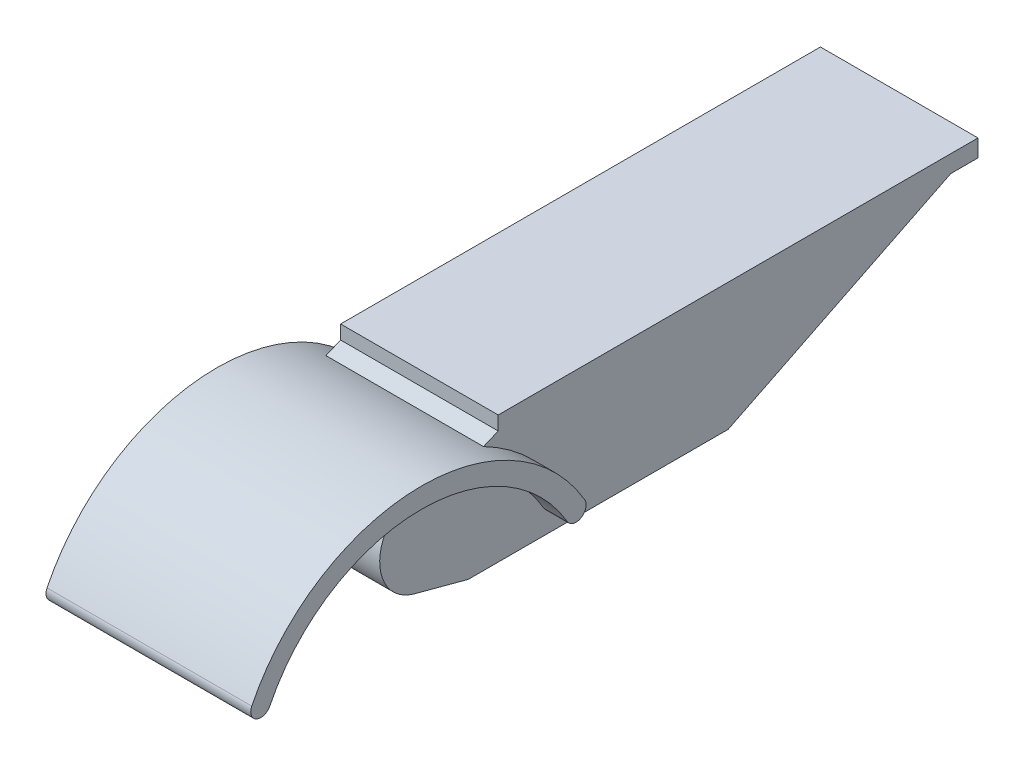
ISO-10303-21;
HEADER;
FILE_DESCRIPTION(('STEP AP214'),'2;1');
FILE_NAME('part.step','',(''),(''),'','','');
FILE_SCHEMA(('AUTOMOTIVE_DESIGN { 1 0 10303 214 1 1 1 1 }'));
ENDSEC;
DATA;
#1=APPLICATION_CONTEXT('core data for automotive mechanical design processes');
#2=APPLICATION_PROTOCOL_DEFINITION('international standard','automotive_design',2000,#1);
#3=PRODUCT_CONTEXT('',#1,'mechanical');
#4=PRODUCT('Part','Part','',(#3));
#5=PRODUCT_RELATED_PRODUCT_CATEGORY('part','',(#4));
#6=PRODUCT_DEFINITION_FORMATION('','',#4);
#7=PRODUCT_DEFINITION_CONTEXT('part definition',#1,'design');
#8=PRODUCT_DEFINITION('design','',#6,#7);
#9=PRODUCT_DEFINITION_SHAPE('','',#8);
#10=(LENGTH_UNIT() NAMED_UNIT(*) SI_UNIT(.MILLI.,.METRE.));
#11=(NAMED_UNIT(*) PLANE_ANGLE_UNIT() SI_UNIT($,.RADIAN.));
#12=(NAMED_UNIT(*) SI_UNIT($,.STERADIAN.) SOLID_ANGLE_UNIT());
#13=UNCERTAINTY_MEASURE_WITH_UNIT(LENGTH_MEASURE(1.E-05),#10,'distance_accuracy_value','');
#14=(GEOMETRIC_REPRESENTATION_CONTEXT(3) GLOBAL_UNCERTAINTY_ASSIGNED_CONTEXT((#13)) GLOBAL_UNIT_ASSIGNED_CONTEXT((#10,
#11,#12)) REPRESENTATION_CONTEXT('',''));
#15=CARTESIAN_POINT('',(0.,0.,0.));
#16=DIRECTION('',(0.,0.,1.));
#17=DIRECTION('',(1.,0.,0.));
#18=AXIS2_PLACEMENT_3D('',#15,#16,#17);
#19=CARTESIAN_POINT('',(7.9375,12.8355318080951,7.8233016000001));
#20=DIRECTION('',(0.,-0.922412610748472,-0.386205871954569));
#21=DIRECTION('',(0.,0.386205871954569,-0.922412610748472));
#22=AXIS2_PLACEMENT_3D('',#19,#20,#21);
#23=PLANE('',#22);
#24=DIRECTION('',(-1.,0.,0.));
#25=VECTOR('',#24,1.);
#26=CARTESIAN_POINT('',(10.3124,12.2164726663733,9.30186005959419));
#27=LINE('',#26,#25);
#28=CARTESIAN_POINT('',(7.9375,12.2164726663733,9.30186005959419));
#29=VERTEX_POINT('',#28);
#30=CARTESIAN_POINT('',(-7.9375,12.2164726663733,9.30186005959419));
#31=VERTEX_POINT('',#30);
#32=EDGE_CURVE('E168',#29,#31,#27,.T.);
#33=ORIENTED_EDGE('',*,*,#32,.F.);
#34=DIRECTION('',(0.,-0.386205871954569,0.922412610748472));
#35=VECTOR('',#34,1.);
#36=CARTESIAN_POINT('',(7.9375,12.8355318080951,7.8233016000001));
#37=LINE('',#36,#35);
#38=CARTESIAN_POINT('',(7.9375,12.8355318080951,7.8233016000001));
#39=VERTEX_POINT('',#38);
#40=EDGE_CURVE('E188',#39,#29,#37,.T.);
#41=ORIENTED_EDGE('',*,*,#40,.F.);
#42=DIRECTION('',(-1.,0.,0.));
#43=VECTOR('',#42,1.);
#44=CARTESIAN_POINT('',(7.9375,12.8355318080951,7.8233016000001));
#45=LINE('',#44,#43);
#46=CARTESIAN_POINT('',(-7.9375,12.8355318080951,7.8233016000001));
#47=VERTEX_POINT('',#46);
#48=EDGE_CURVE('E238',#39,#47,#45,.T.);
#49=ORIENTED_EDGE('',*,*,#48,.T.);
#50=DIRECTION('',(0.,-0.386205871954569,0.922412610748472));
#51=VECTOR('',#50,1.);
#52=CARTESIAN_POINT('',(-7.9375,12.8355318080951,7.8233016000001));
#53=LINE('',#52,#51);
#54=EDGE_CURVE('E207',#47,#31,#53,.T.);
#55=ORIENTED_EDGE('',*,*,#54,.T.);
#56=EDGE_LOOP('',(#33,#41,#49,#55));
#57=FACE_BOUND('',#56,.T.);
#58=ADVANCED_FACE('F32',(#57),#23,.F.);
#59=CARTESIAN_POINT('',(7.9375,7.39208579999999,15.0622));
#60=DIRECTION('',(-1.,0.,0.));
#61=DIRECTION('',(0.,0.,1.));
#62=AXIS2_PLACEMENT_3D('',#59,#60,#61);
#63=CYLINDRICAL_SURFACE('',#62,4.6990254);
#64=DIRECTION('',(-1.,0.,0.));
#65=VECTOR('',#64,1.);
#66=CARTESIAN_POINT('',(0.,12.0716462496771,15.4894630427067));
#67=LINE('',#66,#65);
#68=CARTESIAN_POINT('',(-7.9375,12.0716462496771,15.4894630427067));
#69=VERTEX_POINT('',#68);
#70=CARTESIAN_POINT('',(7.9375,12.0716462496771,15.4894630427067));
#71=VERTEX_POINT('',#70);
#72=EDGE_CURVE('E178',#69,#71,#67,.F.);
#73=ORIENTED_EDGE('',*,*,#72,.F.);
#74=CARTESIAN_POINT('',(-7.9375,7.39208579999999,15.0622));
#75=DIRECTION('',(1.,0.,0.));
#76=DIRECTION('',(0.,0.,-1.));
#77=AXIS2_PLACEMENT_3D('',#74,#75,#76);
#78=CIRCLE('',#77,4.6990254);
#79=CARTESIAN_POINT('',(-7.9375,2.85317363823335,16.278389170159));
#80=VERTEX_POINT('',#79);
#81=EDGE_CURVE('E210',#69,#80,#78,.T.);
#82=ORIENTED_EDGE('',*,*,#81,.T.);
#83=DIRECTION('',(-1.,0.,0.));
#84=VECTOR('',#83,1.);
#85=CARTESIAN_POINT('',(7.9375,2.85317363823335,16.278389170159));
#86=LINE('',#85,#84);
#87=CARTESIAN_POINT('',(7.9375,2.85317363823335,16.278389170159));
#88=VERTEX_POINT('',#87);
#89=EDGE_CURVE('E235',#88,#80,#86,.T.);
#90=ORIENTED_EDGE('',*,*,#89,.F.);
#91=CARTESIAN_POINT('',(7.9375,7.39208579999999,15.0622));
#92=DIRECTION('',(1.,0.,0.));
#93=DIRECTION('',(0.,0.,-1.));
#94=AXIS2_PLACEMENT_3D('',#91,#92,#93);
#95=CIRCLE('',#94,4.6990254);
#96=EDGE_CURVE('E190',#71,#88,#95,.T.);
#97=ORIENTED_EDGE('',*,*,#96,.F.);
#98=EDGE_LOOP('',(#73,#82,#90,#97));
#99=FACE_BOUND('',#98,.T.);
#100=ADVANCED_FACE('F287',(#99),#63,.T.);
#101=CARTESIAN_POINT('',(7.9375,7.39208579999999,15.0622));
#102=DIRECTION('',(1.,0.,0.));
#103=DIRECTION('',(0.,0.,-1.));
#104=AXIS2_PLACEMENT_3D('',#101,#102,#103);
#105=PLANE('',#104);
#106=CARTESIAN_POINT('',(7.9375,4.34318975392666,2.3622));
#107=DIRECTION('',(1.,0.,0.));
#108=DIRECTION('',(0.,0.,-1.));
#109=AXIS2_PLACEMENT_3D('',#106,#107,#108);
#110=CIRCLE('',#109,1.01622914961968);
#111=CARTESIAN_POINT('',(7.9375,4.85678452811905,1.48530656721639));
#112=VERTEX_POINT('',#111);
#113=CARTESIAN_POINT('',(7.9375,3.82959497973428,3.2390934327836));
#114=VERTEX_POINT('',#113);
#115=EDGE_CURVE('E47',#112,#114,#110,.F.);
#116=ORIENTED_EDGE('',*,*,#115,.T.);
#117=CARTESIAN_POINT('',(7.9375,-4.77094604035219,17.9233509795218));
#118=DIRECTION('',(1.,0.,0.));
#119=DIRECTION('',(0.,0.,-1.));
#120=AXIS2_PLACEMENT_3D('',#117,#118,#119);
#121=CIRCLE('',#120,17.0175417007606);
#122=EDGE_CURVE('E167',#114,#71,#121,.T.);
#123=ORIENTED_EDGE('',*,*,#122,.T.);
#124=ORIENTED_EDGE('',*,*,#96,.T.);
#125=DIRECTION('',(0.,-0.258817322025755,-0.965926287984449));
#126=VECTOR('',#125,1.);
#127=CARTESIAN_POINT('',(7.9375,2.85317363823335,16.278389170159));
#128=LINE('',#127,#126);
#129=CARTESIAN_POINT('',(7.9375,1.39540447894536,10.8378817815958));
#130=VERTEX_POINT('',#129);
#131=EDGE_CURVE('E192',#88,#130,#128,.T.);
#132=ORIENTED_EDGE('',*,*,#131,.T.);
#133=DIRECTION('',(0.,0.,-1.));
#134=VECTOR('',#133,1.);
#135=CARTESIAN_POINT('',(7.9375,1.39540447894536,10.8378817815958));
#136=LINE('',#135,#134);
#137=CARTESIAN_POINT('',(7.9375,1.39540447894536,-15.3494674184041));
#138=VERTEX_POINT('',#137);
#139=EDGE_CURVE('E194',#130,#138,#136,.T.);
#140=ORIENTED_EDGE('',*,*,#139,.T.);
#141=DIRECTION('',(0.,0.44373871569456,-0.896156209705508));
#142=VECTOR('',#141,1.);
#143=CARTESIAN_POINT('',(7.9375,12.4952298789454,-37.7662120184041));
#144=LINE('',#143,#142);
#145=CARTESIAN_POINT('',(7.9375,12.4952298789454,-37.7662120184041));
#146=VERTEX_POINT('',#145);
#147=EDGE_CURVE('E196',#138,#146,#144,.T.);
#148=ORIENTED_EDGE('',*,*,#147,.T.);
#149=DIRECTION('',(0.,0.,-1.));
#150=VECTOR('',#149,1.);
#151=CARTESIAN_POINT('',(7.9375,12.4952298789454,-37.7662120184041));
#152=LINE('',#151,#150);
#153=CARTESIAN_POINT('',(7.9375,12.4952298789454,-40.513));
#154=VERTEX_POINT('',#153);
#155=EDGE_CURVE('E198',#146,#154,#152,.T.);
#156=ORIENTED_EDGE('',*,*,#155,.T.);
#157=DIRECTION('',(0.,1.,0.));
#158=VECTOR('',#157,1.);
#159=CARTESIAN_POINT('',(7.9375,14.235338714813,-40.513));
#160=LINE('',#159,#158);
#161=CARTESIAN_POINT('',(7.9375,14.235338714813,-40.513));
#162=VERTEX_POINT('',#161);
#163=EDGE_CURVE('E200',#154,#162,#160,.T.);
#164=ORIENTED_EDGE('',*,*,#163,.T.);
#165=DIRECTION('',(0.,0.,1.));
#166=VECTOR('',#165,1.);
#167=CARTESIAN_POINT('',(7.9375,14.235338714813,7.8233016000001));
#168=LINE('',#167,#166);
#169=CARTESIAN_POINT('',(7.9375,14.235338714813,7.8233016000001));
#170=VERTEX_POINT('',#169);
#171=EDGE_CURVE('E182',#162,#170,#168,.T.);
#172=ORIENTED_EDGE('',*,*,#171,.T.);
#173=DIRECTION('',(0.,-1.,0.));
#174=VECTOR('',#173,1.);
#175=CARTESIAN_POINT('',(7.9375,14.235338714813,7.8233016000001));
#176=LINE('',#175,#174);
#177=EDGE_CURVE('E185',#170,#39,#176,.T.);
#178=ORIENTED_EDGE('',*,*,#177,.T.);
#179=ORIENTED_EDGE('',*,*,#40,.T.);
#180=CARTESIAN_POINT('',(7.9375,-4.77094604035219,17.9233509795218));
#181=DIRECTION('',(1.,0.,0.));
#182=DIRECTION('',(0.,0.,-1.));
#183=AXIS2_PLACEMENT_3D('',#180,#181,#182);
#184=CIRCLE('',#183,19.05);
#185=EDGE_CURVE('E52',#29,#112,#184,.F.);
#186=ORIENTED_EDGE('',*,*,#185,.T.);
#187=EDGE_LOOP('',(#116,#123,#124,#132,#140,#148,#156,#164,#172,#178,#179,#186));
#188=FACE_BOUND('',#187,.T.);
#189=ADVANCED_FACE('F293',(#188),#105,.T.);
#190=CARTESIAN_POINT('',(-7.9375,7.39208579999999,15.0622));
#191=DIRECTION('',(1.,0.,0.));
#192=DIRECTION('',(0.,0.,-1.));
#193=AXIS2_PLACEMENT_3D('',#190,#191,#192);
#194=PLANE('',#193);
#195=CARTESIAN_POINT('',(-7.9375,-4.77094604035219,17.9233509795218));
#196=DIRECTION('',(1.,0.,0.));
#197=DIRECTION('',(0.,0.,-1.));
#198=AXIS2_PLACEMENT_3D('',#195,#196,#197);
#199=CIRCLE('',#198,17.0175417007606);
#200=CARTESIAN_POINT('',(-7.9375,3.82959497973428,3.2390934327836));
#201=VERTEX_POINT('',#200);
#202=EDGE_CURVE('E11',#201,#69,#199,.T.);
#203=ORIENTED_EDGE('',*,*,#202,.F.);
#204=CARTESIAN_POINT('',(-7.9375,4.34318975392666,2.3622));
#205=DIRECTION('',(1.,0.,0.));
#206=DIRECTION('',(0.,0.,-1.));
#207=AXIS2_PLACEMENT_3D('',#204,#205,#206);
#208=CIRCLE('',#207,1.01622914961968);
#209=CARTESIAN_POINT('',(-7.9375,4.85678452811904,1.4853065672164));
#210=VERTEX_POINT('',#209);
#211=EDGE_CURVE('E40',#210,#201,#208,.F.);
#212=ORIENTED_EDGE('',*,*,#211,.F.);
#213=CARTESIAN_POINT('',(-7.9375,-4.77094604035219,17.9233509795218));
#214=DIRECTION('',(1.,0.,0.));
#215=DIRECTION('',(0.,0.,-1.));
#216=AXIS2_PLACEMENT_3D('',#213,#214,#215);
#217=CIRCLE('',#216,19.05);
#218=EDGE_CURVE('E244',#31,#210,#217,.F.);
#219=ORIENTED_EDGE('',*,*,#218,.F.);
#220=ORIENTED_EDGE('',*,*,#54,.F.);
#221=DIRECTION('',(0.,-1.,0.));
#222=VECTOR('',#221,1.);
#223=CARTESIAN_POINT('',(-7.9375,14.235338714813,7.8233016000001));
#224=LINE('',#223,#222);
#225=CARTESIAN_POINT('',(-7.9375,14.235338714813,7.8233016000001));
#226=VERTEX_POINT('',#225);
#227=EDGE_CURVE('E205',#226,#47,#224,.T.);
#228=ORIENTED_EDGE('',*,*,#227,.F.);
#229=DIRECTION('',(0.,0.,1.));
#230=VECTOR('',#229,1.);
#231=CARTESIAN_POINT('',(-7.9375,14.235338714813,7.8233016000001));
#232=LINE('',#231,#230);
#233=CARTESIAN_POINT('',(-7.9375,14.235338714813,-40.513));
#234=VERTEX_POINT('',#233);
#235=EDGE_CURVE('E181',#234,#226,#232,.T.);
#236=ORIENTED_EDGE('',*,*,#235,.F.);
#237=DIRECTION('',(0.,1.,0.));
#238=VECTOR('',#237,1.);
#239=CARTESIAN_POINT('',(-7.9375,14.235338714813,-40.513));
#240=LINE('',#239,#238);
#241=CARTESIAN_POINT('',(-7.9375,12.4952298789454,-40.513));
#242=VERTEX_POINT('',#241);
#243=EDGE_CURVE('E186',#242,#234,#240,.T.);
#244=ORIENTED_EDGE('',*,*,#243,.F.);
#245=DIRECTION('',(0.,0.,-1.));
#246=VECTOR('',#245,1.);
#247=CARTESIAN_POINT('',(-7.9375,12.4952298789454,-37.7662120184041));
#248=LINE('',#247,#246);
#249=CARTESIAN_POINT('',(-7.9375,12.4952298789454,-37.7662120184041));
#250=VERTEX_POINT('',#249);
#251=EDGE_CURVE('E218',#250,#242,#248,.T.);
#252=ORIENTED_EDGE('',*,*,#251,.F.);
#253=DIRECTION('',(0.,0.44373871569456,-0.896156209705508));
#254=VECTOR('',#253,1.);
#255=CARTESIAN_POINT('',(-7.9375,12.4952298789454,-37.7662120184041));
#256=LINE('',#255,#254);
#257=CARTESIAN_POINT('',(-7.9375,1.39540447894536,-15.3494674184041));
#258=VERTEX_POINT('',#257);
#259=EDGE_CURVE('E216',#258,#250,#256,.T.);
#260=ORIENTED_EDGE('',*,*,#259,.F.);
#261=DIRECTION('',(0.,0.,-1.));
#262=VECTOR('',#261,1.);
#263=CARTESIAN_POINT('',(-7.9375,1.39540447894536,10.8378817815958));
#264=LINE('',#263,#262);
#265=CARTESIAN_POINT('',(-7.9375,1.39540447894536,10.8378817815958));
#266=VERTEX_POINT('',#265);
#267=EDGE_CURVE('E214',#266,#258,#264,.T.);
#268=ORIENTED_EDGE('',*,*,#267,.F.);
#269=DIRECTION('',(0.,-0.258817322025755,-0.965926287984449));
#270=VECTOR('',#269,1.);
#271=CARTESIAN_POINT('',(-7.9375,2.85317363823335,16.278389170159));
#272=LINE('',#271,#270);
#273=EDGE_CURVE('E212',#80,#266,#272,.T.);
#274=ORIENTED_EDGE('',*,*,#273,.F.);
#275=ORIENTED_EDGE('',*,*,#81,.F.);
#276=EDGE_LOOP('',(#203,#212,#219,#220,#228,#236,#244,#252,#260,#268,#274,#275));
#277=FACE_BOUND('',#276,.T.);
#278=ADVANCED_FACE('F307',(#277),#194,.F.);
#279=CARTESIAN_POINT('',(7.9375,14.235338714813,7.8233016000001));
#280=DIRECTION('',(0.,-1.,0.));
#281=DIRECTION('',(0.,0.,-1.));
#282=AXIS2_PLACEMENT_3D('',#279,#280,#281);
#283=PLANE('',#282);
#284=ORIENTED_EDGE('',*,*,#235,.T.);
#285=DIRECTION('',(-1.,0.,0.));
#286=VECTOR('',#285,1.);
#287=CARTESIAN_POINT('',(7.9375,14.235338714813,7.8233016000001));
#288=LINE('',#287,#286);
#289=EDGE_CURVE('E241',#170,#226,#288,.T.);
#290=ORIENTED_EDGE('',*,*,#289,.F.);
#291=ORIENTED_EDGE('',*,*,#171,.F.);
#292=DIRECTION('',(-1.,0.,0.));
#293=VECTOR('',#292,1.);
#294=CARTESIAN_POINT('',(7.9375,14.235338714813,-40.513));
#295=LINE('',#294,#293);
#296=EDGE_CURVE('E202',#162,#234,#295,.T.);
#297=ORIENTED_EDGE('',*,*,#296,.T.);
#298=EDGE_LOOP('',(#284,#290,#291,#297));
#299=FACE_BOUND('',#298,.T.);
#300=ADVANCED_FACE('F34',(#299),#283,.F.);
#301=CARTESIAN_POINT('',(7.9375,14.235338714813,7.8233016000001));
#302=DIRECTION('',(0.,0.,-1.));
#303=DIRECTION('',(-1.,0.,0.));
#304=AXIS2_PLACEMENT_3D('',#301,#302,#303);
#305=PLANE('',#304);
#306=ORIENTED_EDGE('',*,*,#227,.T.);
#307=ORIENTED_EDGE('',*,*,#48,.F.);
#308=ORIENTED_EDGE('',*,*,#177,.F.);
#309=ORIENTED_EDGE('',*,*,#289,.T.);
#310=EDGE_LOOP('',(#306,#307,#308,#309));
#311=FACE_BOUND('',#310,.T.);
#312=ADVANCED_FACE('F297',(#311),#305,.F.);
#313=CARTESIAN_POINT('',(7.9375,2.85317363823335,16.278389170159));
#314=DIRECTION('',(0.,0.965926287984449,-0.258817322025755));
#315=DIRECTION('',(0.,0.258817322025755,0.965926287984449));
#316=AXIS2_PLACEMENT_3D('',#313,#314,#315);
#317=PLANE('',#316);
#318=ORIENTED_EDGE('',*,*,#273,.T.);
#319=DIRECTION('',(-1.,0.,0.));
#320=VECTOR('',#319,1.);
#321=CARTESIAN_POINT('',(7.9375,1.39540447894536,10.8378817815958));
#322=LINE('',#321,#320);
#323=EDGE_CURVE('E232',#130,#266,#322,.T.);
#324=ORIENTED_EDGE('',*,*,#323,.F.);
#325=ORIENTED_EDGE('',*,*,#131,.F.);
#326=ORIENTED_EDGE('',*,*,#89,.T.);
#327=EDGE_LOOP('',(#318,#324,#325,#326));
#328=FACE_BOUND('',#327,.T.);
#329=ADVANCED_FACE('F299',(#328),#317,.F.);
#330=CARTESIAN_POINT('',(7.9375,1.39540447894536,10.8378817815958));
#331=DIRECTION('',(0.,1.,0.));
#332=DIRECTION('',(0.,0.,1.));
#333=AXIS2_PLACEMENT_3D('',#330,#331,#332);
#334=PLANE('',#333);
#335=ORIENTED_EDGE('',*,*,#267,.T.);
#336=DIRECTION('',(-1.,0.,0.));
#337=VECTOR('',#336,1.);
#338=CARTESIAN_POINT('',(7.9375,1.39540447894536,-15.3494674184041));
#339=LINE('',#338,#337);
#340=EDGE_CURVE('E229',#138,#258,#339,.T.);
#341=ORIENTED_EDGE('',*,*,#340,.F.);
#342=ORIENTED_EDGE('',*,*,#139,.F.);
#343=ORIENTED_EDGE('',*,*,#323,.T.);
#344=EDGE_LOOP('',(#335,#341,#342,#343));
#345=FACE_BOUND('',#344,.T.);
#346=ADVANCED_FACE('F305',(#345),#334,.F.);
#347=CARTESIAN_POINT('',(7.9375,12.4952298789454,-37.7662120184041));
#348=DIRECTION('',(0.,0.896156209705508,0.44373871569456));
#349=DIRECTION('',(0.,-0.44373871569456,0.896156209705508));
#350=AXIS2_PLACEMENT_3D('',#347,#348,#349);
#351=PLANE('',#350);
#352=ORIENTED_EDGE('',*,*,#259,.T.);
#353=DIRECTION('',(-1.,0.,0.));
#354=VECTOR('',#353,1.);
#355=CARTESIAN_POINT('',(7.9375,12.4952298789454,-37.7662120184041));
#356=LINE('',#355,#354);
#357=EDGE_CURVE('E226',#146,#250,#356,.T.);
#358=ORIENTED_EDGE('',*,*,#357,.F.);
#359=ORIENTED_EDGE('',*,*,#147,.F.);
#360=ORIENTED_EDGE('',*,*,#340,.T.);
#361=EDGE_LOOP('',(#352,#358,#359,#360));
#362=FACE_BOUND('',#361,.T.);
#363=ADVANCED_FACE('F329',(#362),#351,.F.);
#364=CARTESIAN_POINT('',(7.9375,12.4952298789454,-37.7662120184041));
#365=DIRECTION('',(0.,1.,0.));
#366=DIRECTION('',(0.,0.,1.));
#367=AXIS2_PLACEMENT_3D('',#364,#365,#366);
#368=PLANE('',#367);
#369=ORIENTED_EDGE('',*,*,#251,.T.);
#370=DIRECTION('',(-1.,0.,0.));
#371=VECTOR('',#370,1.);
#372=CARTESIAN_POINT('',(7.9375,12.4952298789454,-40.513));
#373=LINE('',#372,#371);
#374=EDGE_CURVE('E223',#154,#242,#373,.T.);
#375=ORIENTED_EDGE('',*,*,#374,.F.);
#376=ORIENTED_EDGE('',*,*,#155,.F.);
#377=ORIENTED_EDGE('',*,*,#357,.T.);
#378=EDGE_LOOP('',(#369,#375,#376,#377));
#379=FACE_BOUND('',#378,.T.);
#380=ADVANCED_FACE('F325',(#379),#368,.F.);
#381=CARTESIAN_POINT('',(7.9375,14.235338714813,-40.513));
#382=DIRECTION('',(0.,0.,1.));
#383=DIRECTION('',(1.,0.,0.));
#384=AXIS2_PLACEMENT_3D('',#381,#382,#383);
#385=PLANE('',#384);
#386=ORIENTED_EDGE('',*,*,#243,.T.);
#387=ORIENTED_EDGE('',*,*,#296,.F.);
#388=ORIENTED_EDGE('',*,*,#163,.F.);
#389=ORIENTED_EDGE('',*,*,#374,.T.);
#390=EDGE_LOOP('',(#386,#387,#388,#389));
#391=FACE_BOUND('',#390,.T.);
#392=ADVANCED_FACE('F321',(#391),#385,.F.);
#393=CARTESIAN_POINT('',(10.3124,4.34318975392666,2.3622));
#394=DIRECTION('',(-1.,0.,0.));
#395=DIRECTION('',(0.,0.,1.));
#396=AXIS2_PLACEMENT_3D('',#393,#394,#395);
#397=CYLINDRICAL_SURFACE('',#396,1.01622914961968);
#398=DIRECTION('',(-1.,0.,0.));
#399=VECTOR('',#398,1.);
#400=CARTESIAN_POINT('',(10.3124,4.85678452811904,1.4853065672164));
#401=LINE('',#400,#399);
#402=CARTESIAN_POINT('',(-10.3124,4.85678452811904,1.4853065672164));
#403=VERTEX_POINT('',#402);
#404=EDGE_CURVE('E253',#210,#403,#401,.T.);
#405=ORIENTED_EDGE('',*,*,#404,.F.);
#406=ORIENTED_EDGE('',*,*,#211,.T.);
#407=DIRECTION('',(-1.,0.,0.));
#408=VECTOR('',#407,1.);
#409=CARTESIAN_POINT('',(10.3124,3.82959497973428,3.2390934327836));
#410=LINE('',#409,#408);
#411=CARTESIAN_POINT('',(-10.3124,3.82959497973428,3.2390934327836));
#412=VERTEX_POINT('',#411);
#413=EDGE_CURVE('E169',#201,#412,#410,.T.);
#414=ORIENTED_EDGE('',*,*,#413,.T.);
#415=CARTESIAN_POINT('',(-10.3124,4.34318975392666,2.3622));
#416=DIRECTION('',(1.,0.,0.));
#417=DIRECTION('',(0.,0.,-1.));
#418=AXIS2_PLACEMENT_3D('',#415,#416,#417);
#419=CIRCLE('',#418,1.01622914961968);
#420=EDGE_CURVE('E261',#412,#403,#419,.T.);
#421=ORIENTED_EDGE('',*,*,#420,.T.);
#422=EDGE_LOOP('',(#405,#406,#414,#421));
#423=FACE_BOUND('',#422,.T.);
#424=ADVANCED_FACE('F250',(#423),#397,.T.);
#425=CARTESIAN_POINT('',(10.3124,-4.77094604035219,17.9233509795218));
#426=DIRECTION('',(-1.,0.,0.));
#427=DIRECTION('',(0.,0.,1.));
#428=AXIS2_PLACEMENT_3D('',#425,#426,#427);
#429=CYLINDRICAL_SURFACE('',#428,17.0175417007606);
#430=ORIENTED_EDGE('',*,*,#122,.F.);
#431=CARTESIAN_POINT('',(10.3124,3.82959497973428,3.2390934327836));
#432=VERTEX_POINT('',#431);
#433=EDGE_CURVE('E148',#432,#114,#410,.T.);
#434=ORIENTED_EDGE('',*,*,#433,.F.);
#435=CARTESIAN_POINT('',(10.3124,-4.77094604035219,17.9233509795218));
#436=DIRECTION('',(-1.,0.,0.));
#437=DIRECTION('',(0.,0.,-1.));
#438=AXIS2_PLACEMENT_3D('',#435,#436,#437);
#439=CIRCLE('',#438,17.0175417007606);
#440=CARTESIAN_POINT('',(10.3124,2.72723441317373,33.1999348719857));
#441=VERTEX_POINT('',#440);
#442=EDGE_CURVE('E154',#441,#432,#439,.T.);
#443=ORIENTED_EDGE('',*,*,#442,.F.);
#444=DIRECTION('',(-1.,0.,0.));
#445=VECTOR('',#444,1.);
#446=CARTESIAN_POINT('',(10.3124,2.72723441317373,33.1999348719857));
#447=LINE('',#446,#445);
#448=CARTESIAN_POINT('',(-10.3124,2.72723441317373,33.1999348719857));
#449=VERTEX_POINT('',#448);
#450=EDGE_CURVE('E258',#441,#449,#447,.T.);
#451=ORIENTED_EDGE('',*,*,#450,.T.);
#452=CARTESIAN_POINT('',(-10.3124,-4.77094604035219,17.9233509795218));
#453=DIRECTION('',(-1.,0.,0.));
#454=DIRECTION('',(0.,0.,-1.));
#455=AXIS2_PLACEMENT_3D('',#452,#453,#454);
#456=CIRCLE('',#455,17.0175417007606);
#457=EDGE_CURVE('E257',#449,#412,#456,.T.);
#458=ORIENTED_EDGE('',*,*,#457,.T.);
#459=ORIENTED_EDGE('',*,*,#413,.F.);
#460=ORIENTED_EDGE('',*,*,#202,.T.);
#461=ORIENTED_EDGE('',*,*,#72,.T.);
#462=EDGE_LOOP('',(#430,#434,#443,#451,#458,#459,#460,#461));
#463=FACE_BOUND('',#462,.T.);
#464=ADVANCED_FACE('F165',(#463),#429,.F.);
#465=ORIENTED_EDGE('',*,*,#115,.F.);
#466=CARTESIAN_POINT('',(10.3124,4.85678452811904,1.4853065672164));
#467=VERTEX_POINT('',#466);
#468=EDGE_CURVE('E150',#467,#112,#401,.T.);
#469=ORIENTED_EDGE('',*,*,#468,.F.);
#470=CARTESIAN_POINT('',(10.3124,4.34318975392666,2.3622));
#471=DIRECTION('',(1.,0.,0.));
#472=DIRECTION('',(0.,0.,-1.));
#473=AXIS2_PLACEMENT_3D('',#470,#471,#472);
#474=CIRCLE('',#473,1.01622914961968);
#475=EDGE_CURVE('E144',#432,#467,#474,.T.);
#476=ORIENTED_EDGE('',*,*,#475,.F.);
#477=ORIENTED_EDGE('',*,*,#433,.T.);
#478=EDGE_LOOP('',(#465,#469,#476,#477));
#479=FACE_BOUND('',#478,.T.);
#480=ADVANCED_FACE('F146',(#479),#397,.T.);
#481=CARTESIAN_POINT('',(10.3124,-4.77094604035219,17.9233509795218));
#482=DIRECTION('',(-1.,0.,0.));
#483=DIRECTION('',(0.,0.,1.));
#484=AXIS2_PLACEMENT_3D('',#481,#482,#483);
#485=CYLINDRICAL_SURFACE('',#484,19.05);
#486=ORIENTED_EDGE('',*,*,#185,.F.);
#487=ORIENTED_EDGE('',*,*,#32,.T.);
#488=ORIENTED_EDGE('',*,*,#218,.T.);
#489=ORIENTED_EDGE('',*,*,#404,.T.);
#490=CARTESIAN_POINT('',(-10.3124,-4.77094604035219,17.9233509795218));
#491=DIRECTION('',(1.,0.,0.));
#492=DIRECTION('',(0.,0.,-1.));
#493=AXIS2_PLACEMENT_3D('',#490,#491,#492);
#494=CIRCLE('',#493,19.05);
#495=CARTESIAN_POINT('',(-10.3124,3.62276558682627,35.0244651280143));
#496=VERTEX_POINT('',#495);
#497=EDGE_CURVE('E263',#403,#496,#494,.T.);
#498=ORIENTED_EDGE('',*,*,#497,.T.);
#499=DIRECTION('',(-1.,0.,0.));
#500=VECTOR('',#499,1.);
#501=CARTESIAN_POINT('',(10.3124,3.62276558682627,35.0244651280143));
#502=LINE('',#501,#500);
#503=CARTESIAN_POINT('',(10.3124,3.62276558682627,35.0244651280143));
#504=VERTEX_POINT('',#503);
#505=EDGE_CURVE('E270',#504,#496,#502,.T.);
#506=ORIENTED_EDGE('',*,*,#505,.F.);
#507=CARTESIAN_POINT('',(10.3124,-4.77094604035219,17.9233509795218));
#508=DIRECTION('',(1.,0.,0.));
#509=DIRECTION('',(0.,0.,-1.));
#510=AXIS2_PLACEMENT_3D('',#507,#508,#509);
#511=CIRCLE('',#510,19.05);
#512=EDGE_CURVE('E153',#467,#504,#511,.T.);
#513=ORIENTED_EDGE('',*,*,#512,.F.);
#514=ORIENTED_EDGE('',*,*,#468,.T.);
#515=EDGE_LOOP('',(#486,#487,#488,#489,#498,#506,#513,#514));
#516=FACE_BOUND('',#515,.T.);
#517=ADVANCED_FACE('F275',(#516),#485,.T.);
#518=CARTESIAN_POINT('',(10.3124,3.175,34.1122));
#519=DIRECTION('',(-1.,0.,0.));
#520=DIRECTION('',(0.,0.,1.));
#521=AXIS2_PLACEMENT_3D('',#518,#519,#520);
#522=CYLINDRICAL_SURFACE('',#521,1.01622914961968);
#523=CARTESIAN_POINT('',(-10.3124,3.175,34.1122));
#524=DIRECTION('',(1.,0.,0.));
#525=DIRECTION('',(0.,0.,-1.));
#526=AXIS2_PLACEMENT_3D('',#523,#524,#525);
#527=CIRCLE('',#526,1.01622914961968);
#528=EDGE_CURVE('E163',#496,#449,#527,.T.);
#529=ORIENTED_EDGE('',*,*,#528,.T.);
#530=ORIENTED_EDGE('',*,*,#450,.F.);
#531=CARTESIAN_POINT('',(10.3124,3.175,34.1122));
#532=DIRECTION('',(1.,0.,0.));
#533=DIRECTION('',(0.,0.,-1.));
#534=AXIS2_PLACEMENT_3D('',#531,#532,#533);
#535=CIRCLE('',#534,1.01622914961968);
#536=EDGE_CURVE('E159',#504,#441,#535,.T.);
#537=ORIENTED_EDGE('',*,*,#536,.F.);
#538=ORIENTED_EDGE('',*,*,#505,.T.);
#539=EDGE_LOOP('',(#529,#530,#537,#538));
#540=FACE_BOUND('',#539,.T.);
#541=ADVANCED_FACE('F277',(#540),#522,.T.);
#542=CARTESIAN_POINT('',(10.3124,-0.797973020176094,26.0177754897609));
#543=DIRECTION('',(1.,0.,0.));
#544=DIRECTION('',(0.,0.,-1.));
#545=AXIS2_PLACEMENT_3D('',#542,#543,#544);
#546=PLANE('',#545);
#547=ORIENTED_EDGE('',*,*,#442,.T.);
#548=ORIENTED_EDGE('',*,*,#475,.T.);
#549=ORIENTED_EDGE('',*,*,#512,.T.);
#550=ORIENTED_EDGE('',*,*,#536,.T.);
#551=EDGE_LOOP('',(#547,#548,#549,#550));
#552=FACE_BOUND('',#551,.T.);
#553=ADVANCED_FACE('F157',(#552),#546,.T.);
#554=CARTESIAN_POINT('',(-10.3124,-0.797973020176094,26.0177754897609));
#555=DIRECTION('',(1.,0.,0.));
#556=DIRECTION('',(0.,0.,-1.));
#557=AXIS2_PLACEMENT_3D('',#554,#555,#556);
#558=PLANE('',#557);
#559=ORIENTED_EDGE('',*,*,#457,.F.);
#560=ORIENTED_EDGE('',*,*,#528,.F.);
#561=ORIENTED_EDGE('',*,*,#497,.F.);
#562=ORIENTED_EDGE('',*,*,#420,.F.);
#563=EDGE_LOOP('',(#559,#560,#561,#562));
#564=FACE_BOUND('',#563,.T.);
#565=ADVANCED_FACE('F278',(#564),#558,.F.);
#566=CLOSED_SHELL('',(#58,#100,#189,#278,#300,#312,#329,#346,#363,#380,#392,#424,#464,#480,#517,
#541,#553,#565));
#567=MANIFOLD_SOLID_BREP('B2',#566);
#568=ADVANCED_BREP_SHAPE_REPRESENTATION('',(#18,#567),#14);
#569=SHAPE_DEFINITION_REPRESENTATION(#9,#568);
ENDSEC;
END-ISO-10303-21;
